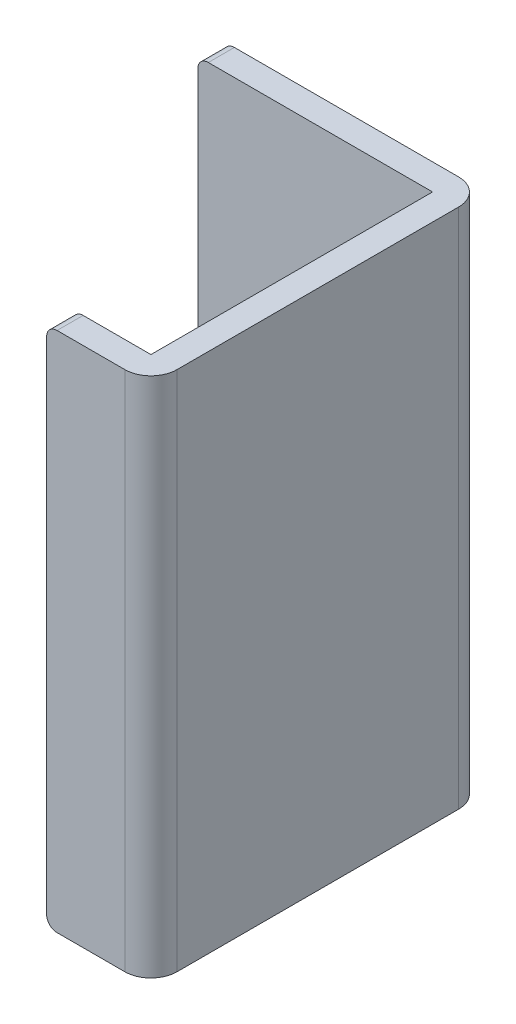
ISO-10303-21;
HEADER;
FILE_DESCRIPTION(('STEP AP214'),'2;1');
FILE_NAME('part.step','',(''),(''),'','','');
FILE_SCHEMA(('AUTOMOTIVE_DESIGN { 1 0 10303 214 1 1 1 1 }'));
ENDSEC;
DATA;
#1=APPLICATION_CONTEXT('core data for automotive mechanical design processes');
#2=APPLICATION_PROTOCOL_DEFINITION('international standard','automotive_design',2000,#1);
#3=PRODUCT_CONTEXT('',#1,'mechanical');
#4=PRODUCT('Part','Part','',(#3));
#5=PRODUCT_RELATED_PRODUCT_CATEGORY('part','',(#4));
#6=PRODUCT_DEFINITION_FORMATION('','',#4);
#7=PRODUCT_DEFINITION_CONTEXT('part definition',#1,'design');
#8=PRODUCT_DEFINITION('design','',#6,#7);
#9=PRODUCT_DEFINITION_SHAPE('','',#8);
#10=(LENGTH_UNIT() NAMED_UNIT(*) SI_UNIT(.MILLI.,.METRE.));
#11=(NAMED_UNIT(*) PLANE_ANGLE_UNIT() SI_UNIT($,.RADIAN.));
#12=(NAMED_UNIT(*) SI_UNIT($,.STERADIAN.) SOLID_ANGLE_UNIT());
#13=UNCERTAINTY_MEASURE_WITH_UNIT(LENGTH_MEASURE(1.E-05),#10,'distance_accuracy_value','');
#14=(GEOMETRIC_REPRESENTATION_CONTEXT(3) GLOBAL_UNCERTAINTY_ASSIGNED_CONTEXT((#13)) GLOBAL_UNIT_ASSIGNED_CONTEXT((#10,
#11,#12)) REPRESENTATION_CONTEXT('',''));
#15=CARTESIAN_POINT('',(0.,0.,0.));
#16=DIRECTION('',(0.,0.,1.));
#17=DIRECTION('',(1.,0.,0.));
#18=AXIS2_PLACEMENT_3D('',#15,#16,#17);
#19=CARTESIAN_POINT('',(0.31,0.24,0.16));
#20=DIRECTION('',(0.,0.,-1.));
#21=DIRECTION('',(1.,0.,0.));
#22=AXIS2_PLACEMENT_3D('',#19,#20,#21);
#23=CYLINDRICAL_SURFACE('',#22,0.01);
#24=CARTESIAN_POINT('',(0.31,0.24,0.));
#25=DIRECTION('',(0.,0.,-1.));
#26=DIRECTION('',(1.,0.,0.));
#27=AXIS2_PLACEMENT_3D('',#24,#25,#26);
#28=CIRCLE('',#27,0.01);
#29=CARTESIAN_POINT('',(0.3,0.24,0.));
#30=VERTEX_POINT('',#29);
#31=CARTESIAN_POINT('',(0.31,0.25,0.));
#32=VERTEX_POINT('',#31);
#33=EDGE_CURVE('E42',#30,#32,#28,.T.);
#34=ORIENTED_EDGE('',*,*,#33,.F.);
#35=DIRECTION('',(0.,0.,-1.));
#36=VECTOR('',#35,1.);
#37=CARTESIAN_POINT('',(0.3,0.24,0.0124999999999979));
#38=LINE('',#37,#36);
#39=CARTESIAN_POINT('',(0.3,0.24,0.024999999999999));
#40=VERTEX_POINT('',#39);
#41=EDGE_CURVE('E220',#40,#30,#38,.T.);
#42=ORIENTED_EDGE('',*,*,#41,.F.);
#43=CARTESIAN_POINT('',(0.31,0.24,0.024999999999999));
#44=DIRECTION('',(0.,0.,1.));
#45=DIRECTION('',(-1.,0.,0.));
#46=AXIS2_PLACEMENT_3D('',#43,#44,#45);
#47=CIRCLE('',#46,0.01);
#48=CARTESIAN_POINT('',(0.31,0.25,0.024999999999999));
#49=VERTEX_POINT('',#48);
#50=EDGE_CURVE('E176',#49,#40,#47,.T.);
#51=ORIENTED_EDGE('',*,*,#50,.F.);
#52=DIRECTION('',(0.,0.,1.));
#53=VECTOR('',#52,1.);
#54=CARTESIAN_POINT('',(0.31,0.25,0.16));
#55=LINE('',#54,#53);
#56=EDGE_CURVE('E185',#32,#49,#55,.T.);
#57=ORIENTED_EDGE('',*,*,#56,.F.);
#58=EDGE_LOOP('',(#34,#42,#51,#57));
#59=FACE_BOUND('',#58,.T.);
#60=ADVANCED_FACE('F17',(#59),#23,.T.);
#61=CARTESIAN_POINT('',(0.31,-0.24,0.0124999999999979));
#62=DIRECTION('',(0.,0.,1.));
#63=DIRECTION('',(-1.,0.,0.));
#64=AXIS2_PLACEMENT_3D('',#61,#62,#63);
#65=CYLINDRICAL_SURFACE('',#64,0.01);
#66=CARTESIAN_POINT('',(0.31,-0.24,0.));
#67=DIRECTION('',(0.,0.,-1.));
#68=DIRECTION('',(1.,0.,0.));
#69=AXIS2_PLACEMENT_3D('',#66,#67,#68);
#70=CIRCLE('',#69,0.01);
#71=CARTESIAN_POINT('',(0.31,-0.25,0.));
#72=VERTEX_POINT('',#71);
#73=CARTESIAN_POINT('',(0.3,-0.24,0.));
#74=VERTEX_POINT('',#73);
#75=EDGE_CURVE('E93',#72,#74,#70,.T.);
#76=ORIENTED_EDGE('',*,*,#75,.F.);
#77=DIRECTION('',(0.,0.,-1.));
#78=VECTOR('',#77,1.);
#79=CARTESIAN_POINT('',(0.31,-0.25,0.));
#80=LINE('',#79,#78);
#81=CARTESIAN_POINT('',(0.31,-0.25,0.024999999999999));
#82=VERTEX_POINT('',#81);
#83=EDGE_CURVE('E153',#82,#72,#80,.T.);
#84=ORIENTED_EDGE('',*,*,#83,.F.);
#85=CARTESIAN_POINT('',(0.31,-0.24,0.024999999999999));
#86=DIRECTION('',(0.,0.,1.));
#87=DIRECTION('',(-1.,0.,0.));
#88=AXIS2_PLACEMENT_3D('',#85,#86,#87);
#89=CIRCLE('',#88,0.01);
#90=CARTESIAN_POINT('',(0.3,-0.24,0.024999999999999));
#91=VERTEX_POINT('',#90);
#92=EDGE_CURVE('E105',#91,#82,#89,.T.);
#93=ORIENTED_EDGE('',*,*,#92,.F.);
#94=DIRECTION('',(0.,0.,1.));
#95=VECTOR('',#94,1.);
#96=CARTESIAN_POINT('',(0.3,-0.24,0.024999999999999));
#97=LINE('',#96,#95);
#98=EDGE_CURVE('E11',#74,#91,#97,.T.);
#99=ORIENTED_EDGE('',*,*,#98,.F.);
#100=EDGE_LOOP('',(#76,#84,#93,#99));
#101=FACE_BOUND('',#100,.T.);
#102=ADVANCED_FACE('F348',(#101),#65,.T.);
#103=CARTESIAN_POINT('',(0.46,0.24,0.16));
#104=DIRECTION('',(0.,0.,-1.));
#105=DIRECTION('',(1.,0.,0.));
#106=AXIS2_PLACEMENT_3D('',#103,#104,#105);
#107=CYLINDRICAL_SURFACE('',#106,0.01);
#108=CARTESIAN_POINT('',(0.46,0.24,0.295));
#109=DIRECTION('',(0.,0.,-1.));
#110=DIRECTION('',(1.,0.,0.));
#111=AXIS2_PLACEMENT_3D('',#108,#109,#110);
#112=CIRCLE('',#111,0.01);
#113=CARTESIAN_POINT('',(0.45,0.24,0.295));
#114=VERTEX_POINT('',#113);
#115=CARTESIAN_POINT('',(0.46,0.25,0.295));
#116=VERTEX_POINT('',#115);
#117=EDGE_CURVE('E241',#114,#116,#112,.T.);
#118=ORIENTED_EDGE('',*,*,#117,.F.);
#119=DIRECTION('',(0.,0.,-1.));
#120=VECTOR('',#119,1.);
#121=CARTESIAN_POINT('',(0.45,0.24,0.3075));
#122=LINE('',#121,#120);
#123=CARTESIAN_POINT('',(0.45,0.24,0.32));
#124=VERTEX_POINT('',#123);
#125=EDGE_CURVE('E179',#124,#114,#122,.T.);
#126=ORIENTED_EDGE('',*,*,#125,.F.);
#127=CARTESIAN_POINT('',(0.46,0.24,0.32));
#128=DIRECTION('',(0.,0.,1.));
#129=DIRECTION('',(-1.,0.,0.));
#130=AXIS2_PLACEMENT_3D('',#127,#128,#129);
#131=CIRCLE('',#130,0.01);
#132=CARTESIAN_POINT('',(0.46,0.25,0.32));
#133=VERTEX_POINT('',#132);
#134=EDGE_CURVE('E21',#133,#124,#131,.T.);
#135=ORIENTED_EDGE('',*,*,#134,.F.);
#136=DIRECTION('',(0.,0.,1.));
#137=VECTOR('',#136,1.);
#138=CARTESIAN_POINT('',(0.46,0.25,0.16));
#139=LINE('',#138,#137);
#140=EDGE_CURVE('E218',#116,#133,#139,.T.);
#141=ORIENTED_EDGE('',*,*,#140,.F.);
#142=EDGE_LOOP('',(#118,#126,#135,#141));
#143=FACE_BOUND('',#142,.T.);
#144=ADVANCED_FACE('F322',(#143),#107,.T.);
#145=CARTESIAN_POINT('',(0.46,-0.24,0.3075));
#146=DIRECTION('',(0.,0.,1.));
#147=DIRECTION('',(-1.,0.,0.));
#148=AXIS2_PLACEMENT_3D('',#145,#146,#147);
#149=CYLINDRICAL_SURFACE('',#148,0.01);
#150=CARTESIAN_POINT('',(0.46,-0.24,0.295));
#151=DIRECTION('',(0.,0.,-1.));
#152=DIRECTION('',(1.,0.,0.));
#153=AXIS2_PLACEMENT_3D('',#150,#151,#152);
#154=CIRCLE('',#153,0.01);
#155=CARTESIAN_POINT('',(0.46,-0.25,0.295));
#156=VERTEX_POINT('',#155);
#157=CARTESIAN_POINT('',(0.45,-0.24,0.295));
#158=VERTEX_POINT('',#157);
#159=EDGE_CURVE('E223',#156,#158,#154,.T.);
#160=ORIENTED_EDGE('',*,*,#159,.F.);
#161=DIRECTION('',(0.,0.,-1.));
#162=VECTOR('',#161,1.);
#163=CARTESIAN_POINT('',(0.46,-0.25,0.295));
#164=LINE('',#163,#162);
#165=CARTESIAN_POINT('',(0.46,-0.25,0.32));
#166=VERTEX_POINT('',#165);
#167=EDGE_CURVE('E155',#166,#156,#164,.T.);
#168=ORIENTED_EDGE('',*,*,#167,.F.);
#169=CARTESIAN_POINT('',(0.46,-0.24,0.32));
#170=DIRECTION('',(0.,0.,1.));
#171=DIRECTION('',(-1.,0.,0.));
#172=AXIS2_PLACEMENT_3D('',#169,#170,#171);
#173=CIRCLE('',#172,0.01);
#174=CARTESIAN_POINT('',(0.45,-0.24,0.32));
#175=VERTEX_POINT('',#174);
#176=EDGE_CURVE('E174',#175,#166,#173,.T.);
#177=ORIENTED_EDGE('',*,*,#176,.F.);
#178=DIRECTION('',(0.,0.,1.));
#179=VECTOR('',#178,1.);
#180=CARTESIAN_POINT('',(0.45,-0.24,0.32));
#181=LINE('',#180,#179);
#182=EDGE_CURVE('E183',#158,#175,#181,.T.);
#183=ORIENTED_EDGE('',*,*,#182,.F.);
#184=EDGE_LOOP('',(#160,#168,#177,#183));
#185=FACE_BOUND('',#184,.T.);
#186=ADVANCED_FACE('F328',(#185),#149,.T.);
#187=CARTESIAN_POINT('',(0.3,-0.25,0.0124999999999979));
#188=DIRECTION('',(1.,0.,0.));
#189=DIRECTION('',(0.,1.,0.));
#190=AXIS2_PLACEMENT_3D('',#187,#188,#189);
#191=PLANE('',#190);
#192=DIRECTION('',(0.,1.,0.));
#193=VECTOR('',#192,1.);
#194=CARTESIAN_POINT('',(0.3,-0.25,0.));
#195=LINE('',#194,#193);
#196=EDGE_CURVE('E172',#74,#30,#195,.T.);
#197=ORIENTED_EDGE('',*,*,#196,.F.);
#198=ORIENTED_EDGE('',*,*,#98,.T.);
#199=DIRECTION('',(0.,1.,0.));
#200=VECTOR('',#199,1.);
#201=CARTESIAN_POINT('',(0.3,-0.25,0.024999999999999));
#202=LINE('',#201,#200);
#203=EDGE_CURVE('E28',#91,#40,#202,.T.);
#204=ORIENTED_EDGE('',*,*,#203,.T.);
#205=ORIENTED_EDGE('',*,*,#41,.T.);
#206=EDGE_LOOP('',(#197,#198,#204,#205));
#207=FACE_BOUND('',#206,.T.);
#208=ADVANCED_FACE('F347',(#207),#191,.F.);
#209=CARTESIAN_POINT('',(0.4125,-0.25,0.024999999999999));
#210=DIRECTION('',(0.,0.,-1.));
#211=DIRECTION('',(-1.,0.,0.));
#212=AXIS2_PLACEMENT_3D('',#209,#210,#211);
#213=PLANE('',#212);
#214=ORIENTED_EDGE('',*,*,#203,.F.);
#215=ORIENTED_EDGE('',*,*,#92,.T.);
#216=DIRECTION('',(1.,0.,0.));
#217=VECTOR('',#216,1.);
#218=CARTESIAN_POINT('',(0.4125,-0.25,0.024999999999999));
#219=LINE('',#218,#217);
#220=CARTESIAN_POINT('',(0.525,-0.25,0.024999999999999));
#221=VERTEX_POINT('',#220);
#222=EDGE_CURVE('E228',#82,#221,#219,.T.);
#223=ORIENTED_EDGE('',*,*,#222,.T.);
#224=DIRECTION('',(0.,1.,0.));
#225=VECTOR('',#224,1.);
#226=CARTESIAN_POINT('',(0.525,-0.25,0.024999999999999));
#227=LINE('',#226,#225);
#228=CARTESIAN_POINT('',(0.525,0.25,0.024999999999999));
#229=VERTEX_POINT('',#228);
#230=EDGE_CURVE('E232',#221,#229,#227,.T.);
#231=ORIENTED_EDGE('',*,*,#230,.T.);
#232=DIRECTION('',(1.,0.,0.));
#233=VECTOR('',#232,1.);
#234=CARTESIAN_POINT('',(0.4125,0.25,0.024999999999999));
#235=LINE('',#234,#233);
#236=EDGE_CURVE('E267',#49,#229,#235,.T.);
#237=ORIENTED_EDGE('',*,*,#236,.F.);
#238=ORIENTED_EDGE('',*,*,#50,.T.);
#239=EDGE_LOOP('',(#214,#215,#223,#231,#237,#238));
#240=FACE_BOUND('',#239,.T.);
#241=ADVANCED_FACE('F343',(#240),#213,.F.);
#242=CARTESIAN_POINT('',(0.4875,-0.25,0.295));
#243=DIRECTION('',(0.,0.,1.));
#244=DIRECTION('',(1.,0.,0.));
#245=AXIS2_PLACEMENT_3D('',#242,#243,#244);
#246=PLANE('',#245);
#247=DIRECTION('',(0.,1.,0.));
#248=VECTOR('',#247,1.);
#249=CARTESIAN_POINT('',(0.45,-0.25,0.295));
#250=LINE('',#249,#248);
#251=EDGE_CURVE('E248',#158,#114,#250,.T.);
#252=ORIENTED_EDGE('',*,*,#251,.T.);
#253=ORIENTED_EDGE('',*,*,#117,.T.);
#254=DIRECTION('',(-1.,0.,0.));
#255=VECTOR('',#254,1.);
#256=CARTESIAN_POINT('',(0.4875,0.25,0.295));
#257=LINE('',#256,#255);
#258=CARTESIAN_POINT('',(0.525,0.25,0.295));
#259=VERTEX_POINT('',#258);
#260=EDGE_CURVE('E272',#259,#116,#257,.T.);
#261=ORIENTED_EDGE('',*,*,#260,.F.);
#262=DIRECTION('',(0.,1.,0.));
#263=VECTOR('',#262,1.);
#264=CARTESIAN_POINT('',(0.525,-0.25,0.295));
#265=LINE('',#264,#263);
#266=CARTESIAN_POINT('',(0.525,-0.25,0.295));
#267=VERTEX_POINT('',#266);
#268=EDGE_CURVE('E256',#267,#259,#265,.T.);
#269=ORIENTED_EDGE('',*,*,#268,.F.);
#270=DIRECTION('',(-1.,0.,0.));
#271=VECTOR('',#270,1.);
#272=CARTESIAN_POINT('',(0.4875,-0.25,0.295));
#273=LINE('',#272,#271);
#274=EDGE_CURVE('E226',#267,#156,#273,.T.);
#275=ORIENTED_EDGE('',*,*,#274,.T.);
#276=ORIENTED_EDGE('',*,*,#159,.T.);
#277=EDGE_LOOP('',(#252,#253,#261,#269,#275,#276));
#278=FACE_BOUND('',#277,.T.);
#279=ADVANCED_FACE('F333',(#278),#246,.F.);
#280=CARTESIAN_POINT('',(0.45,-0.25,0.3075));
#281=DIRECTION('',(1.,0.,0.));
#282=DIRECTION('',(0.,1.,0.));
#283=AXIS2_PLACEMENT_3D('',#280,#281,#282);
#284=PLANE('',#283);
#285=DIRECTION('',(0.,1.,0.));
#286=VECTOR('',#285,1.);
#287=CARTESIAN_POINT('',(0.45,-0.25,0.32));
#288=LINE('',#287,#286);
#289=EDGE_CURVE('E182',#175,#124,#288,.T.);
#290=ORIENTED_EDGE('',*,*,#289,.T.);
#291=ORIENTED_EDGE('',*,*,#125,.T.);
#292=ORIENTED_EDGE('',*,*,#251,.F.);
#293=ORIENTED_EDGE('',*,*,#182,.T.);
#294=EDGE_LOOP('',(#290,#291,#292,#293));
#295=FACE_BOUND('',#294,.T.);
#296=ADVANCED_FACE('F19',(#295),#284,.F.);
#297=CARTESIAN_POINT('',(0.425,0.25,0.16));
#298=DIRECTION('',(0.,-1.,0.));
#299=DIRECTION('',(0.,0.,-1.));
#300=AXIS2_PLACEMENT_3D('',#297,#298,#299);
#301=PLANE('',#300);
#302=ORIENTED_EDGE('',*,*,#260,.T.);
#303=ORIENTED_EDGE('',*,*,#140,.T.);
#304=DIRECTION('',(1.,0.,0.));
#305=VECTOR('',#304,1.);
#306=CARTESIAN_POINT('',(0.5,0.25,0.32));
#307=LINE('',#306,#305);
#308=CARTESIAN_POINT('',(0.525,0.25,0.32));
#309=VERTEX_POINT('',#308);
#310=EDGE_CURVE('E214',#133,#309,#307,.T.);
#311=ORIENTED_EDGE('',*,*,#310,.T.);
#312=CARTESIAN_POINT('',(0.525,0.25,0.295));
#313=DIRECTION('',(0.,1.,0.));
#314=DIRECTION('',(0.,0.,-1.));
#315=AXIS2_PLACEMENT_3D('',#312,#313,#314);
#316=CIRCLE('',#315,0.025);
#317=CARTESIAN_POINT('',(0.55,0.25,0.295));
#318=VERTEX_POINT('',#317);
#319=EDGE_CURVE('E219',#309,#318,#316,.T.);
#320=ORIENTED_EDGE('',*,*,#319,.T.);
#321=DIRECTION('',(0.,0.,-1.));
#322=VECTOR('',#321,1.);
#323=CARTESIAN_POINT('',(0.55,0.25,0.16));
#324=LINE('',#323,#322);
#325=CARTESIAN_POINT('',(0.55,0.25,0.025));
#326=VERTEX_POINT('',#325);
#327=EDGE_CURVE('E266',#318,#326,#324,.T.);
#328=ORIENTED_EDGE('',*,*,#327,.T.);
#329=CARTESIAN_POINT('',(0.525,0.25,0.025));
#330=DIRECTION('',(0.,1.,0.));
#331=DIRECTION('',(0.,0.,-1.));
#332=AXIS2_PLACEMENT_3D('',#329,#330,#331);
#333=CIRCLE('',#332,0.025);
#334=CARTESIAN_POINT('',(0.525,0.25,0.));
#335=VERTEX_POINT('',#334);
#336=EDGE_CURVE('E135',#326,#335,#333,.T.);
#337=ORIENTED_EDGE('',*,*,#336,.T.);
#338=DIRECTION('',(-1.,0.,0.));
#339=VECTOR('',#338,1.);
#340=CARTESIAN_POINT('',(0.425,0.25,0.));
#341=LINE('',#340,#339);
#342=EDGE_CURVE('E142',#335,#32,#341,.T.);
#343=ORIENTED_EDGE('',*,*,#342,.T.);
#344=ORIENTED_EDGE('',*,*,#56,.T.);
#345=ORIENTED_EDGE('',*,*,#236,.T.);
#346=DIRECTION('',(0.,0.,1.));
#347=VECTOR('',#346,1.);
#348=CARTESIAN_POINT('',(0.525,0.25,0.16));
#349=LINE('',#348,#347);
#350=EDGE_CURVE('E210',#229,#259,#349,.T.);
#351=ORIENTED_EDGE('',*,*,#350,.T.);
#352=EDGE_LOOP('',(#302,#303,#311,#320,#328,#337,#343,#344,#345,#351));
#353=FACE_BOUND('',#352,.T.);
#354=ADVANCED_FACE('F299',(#353),#301,.F.);
#355=CARTESIAN_POINT('',(0.425,-0.25,0.16));
#356=DIRECTION('',(0.,-1.,0.));
#357=DIRECTION('',(0.,0.,-1.));
#358=AXIS2_PLACEMENT_3D('',#355,#356,#357);
#359=PLANE('',#358);
#360=ORIENTED_EDGE('',*,*,#222,.F.);
#361=ORIENTED_EDGE('',*,*,#83,.T.);
#362=DIRECTION('',(-1.,0.,0.));
#363=VECTOR('',#362,1.);
#364=CARTESIAN_POINT('',(0.425,-0.25,0.));
#365=LINE('',#364,#363);
#366=CARTESIAN_POINT('',(0.525,-0.25,0.));
#367=VERTEX_POINT('',#366);
#368=EDGE_CURVE('E148',#367,#72,#365,.T.);
#369=ORIENTED_EDGE('',*,*,#368,.F.);
#370=CARTESIAN_POINT('',(0.525,-0.25,0.025));
#371=DIRECTION('',(0.,-1.,0.));
#372=DIRECTION('',(0.,0.,-1.));
#373=AXIS2_PLACEMENT_3D('',#370,#371,#372);
#374=CIRCLE('',#373,0.025);
#375=CARTESIAN_POINT('',(0.55,-0.25,0.025));
#376=VERTEX_POINT('',#375);
#377=EDGE_CURVE('E152',#367,#376,#374,.T.);
#378=ORIENTED_EDGE('',*,*,#377,.T.);
#379=DIRECTION('',(0.,0.,-1.));
#380=VECTOR('',#379,1.);
#381=CARTESIAN_POINT('',(0.55,-0.25,0.16));
#382=LINE('',#381,#380);
#383=CARTESIAN_POINT('',(0.55,-0.25,0.295));
#384=VERTEX_POINT('',#383);
#385=EDGE_CURVE('E193',#384,#376,#382,.T.);
#386=ORIENTED_EDGE('',*,*,#385,.F.);
#387=CARTESIAN_POINT('',(0.525,-0.25,0.295));
#388=DIRECTION('',(0.,-1.,0.));
#389=DIRECTION('',(0.,0.,-1.));
#390=AXIS2_PLACEMENT_3D('',#387,#388,#389);
#391=CIRCLE('',#390,0.025);
#392=CARTESIAN_POINT('',(0.525,-0.25,0.32));
#393=VERTEX_POINT('',#392);
#394=EDGE_CURVE('E162',#384,#393,#391,.T.);
#395=ORIENTED_EDGE('',*,*,#394,.T.);
#396=DIRECTION('',(1.,0.,0.));
#397=VECTOR('',#396,1.);
#398=CARTESIAN_POINT('',(0.5,-0.25,0.32));
#399=LINE('',#398,#397);
#400=EDGE_CURVE('E187',#166,#393,#399,.T.);
#401=ORIENTED_EDGE('',*,*,#400,.F.);
#402=ORIENTED_EDGE('',*,*,#167,.T.);
#403=ORIENTED_EDGE('',*,*,#274,.F.);
#404=DIRECTION('',(0.,0.,1.));
#405=VECTOR('',#404,1.);
#406=CARTESIAN_POINT('',(0.525,-0.25,0.16));
#407=LINE('',#406,#405);
#408=EDGE_CURVE('E252',#221,#267,#407,.T.);
#409=ORIENTED_EDGE('',*,*,#408,.F.);
#410=EDGE_LOOP('',(#360,#361,#369,#378,#386,#395,#401,#402,#403,#409));
#411=FACE_BOUND('',#410,.T.);
#412=ADVANCED_FACE('F151',(#411),#359,.T.);
#413=CARTESIAN_POINT('',(0.425,-0.25,0.));
#414=DIRECTION('',(0.,0.,1.));
#415=DIRECTION('',(1.,0.,0.));
#416=AXIS2_PLACEMENT_3D('',#413,#414,#415);
#417=PLANE('',#416);
#418=ORIENTED_EDGE('',*,*,#368,.T.);
#419=ORIENTED_EDGE('',*,*,#75,.T.);
#420=ORIENTED_EDGE('',*,*,#196,.T.);
#421=ORIENTED_EDGE('',*,*,#33,.T.);
#422=ORIENTED_EDGE('',*,*,#342,.F.);
#423=DIRECTION('',(0.,-1.,0.));
#424=VECTOR('',#423,1.);
#425=CARTESIAN_POINT('',(0.525,-0.25,0.));
#426=LINE('',#425,#424);
#427=EDGE_CURVE('E158',#335,#367,#426,.T.);
#428=ORIENTED_EDGE('',*,*,#427,.T.);
#429=EDGE_LOOP('',(#418,#419,#420,#421,#422,#428));
#430=FACE_BOUND('',#429,.T.);
#431=ADVANCED_FACE('F164',(#430),#417,.F.);
#432=CARTESIAN_POINT('',(0.5,-0.25,0.32));
#433=DIRECTION('',(0.,0.,-1.));
#434=DIRECTION('',(-1.,0.,0.));
#435=AXIS2_PLACEMENT_3D('',#432,#433,#434);
#436=PLANE('',#435);
#437=ORIENTED_EDGE('',*,*,#310,.F.);
#438=ORIENTED_EDGE('',*,*,#134,.T.);
#439=ORIENTED_EDGE('',*,*,#289,.F.);
#440=ORIENTED_EDGE('',*,*,#176,.T.);
#441=ORIENTED_EDGE('',*,*,#400,.T.);
#442=DIRECTION('',(0.,1.,0.));
#443=VECTOR('',#442,1.);
#444=CARTESIAN_POINT('',(0.525,-0.25,0.32));
#445=LINE('',#444,#443);
#446=EDGE_CURVE('E190',#393,#309,#445,.T.);
#447=ORIENTED_EDGE('',*,*,#446,.T.);
#448=EDGE_LOOP('',(#437,#438,#439,#440,#441,#447));
#449=FACE_BOUND('',#448,.T.);
#450=ADVANCED_FACE('F319',(#449),#436,.F.);
#451=CARTESIAN_POINT('',(0.55,-0.25,0.16));
#452=DIRECTION('',(-1.,0.,0.));
#453=DIRECTION('',(0.,0.,1.));
#454=AXIS2_PLACEMENT_3D('',#451,#452,#453);
#455=PLANE('',#454);
#456=ORIENTED_EDGE('',*,*,#385,.T.);
#457=DIRECTION('',(0.,1.,0.));
#458=VECTOR('',#457,1.);
#459=CARTESIAN_POINT('',(0.55,-0.25,0.025));
#460=LINE('',#459,#458);
#461=EDGE_CURVE('E160',#376,#326,#460,.T.);
#462=ORIENTED_EDGE('',*,*,#461,.T.);
#463=ORIENTED_EDGE('',*,*,#327,.F.);
#464=DIRECTION('',(0.,-1.,0.));
#465=VECTOR('',#464,1.);
#466=CARTESIAN_POINT('',(0.55,-0.25,0.295));
#467=LINE('',#466,#465);
#468=EDGE_CURVE('E206',#318,#384,#467,.T.);
#469=ORIENTED_EDGE('',*,*,#468,.T.);
#470=EDGE_LOOP('',(#456,#462,#463,#469));
#471=FACE_BOUND('',#470,.T.);
#472=ADVANCED_FACE('F402',(#471),#455,.F.);
#473=CARTESIAN_POINT('',(0.525,-0.25,0.025));
#474=DIRECTION('',(0.,-1.,0.));
#475=DIRECTION('',(0.,0.,1.));
#476=AXIS2_PLACEMENT_3D('',#473,#474,#475);
#477=CYLINDRICAL_SURFACE('',#476,0.025);
#478=ORIENTED_EDGE('',*,*,#377,.F.);
#479=ORIENTED_EDGE('',*,*,#427,.F.);
#480=ORIENTED_EDGE('',*,*,#336,.F.);
#481=ORIENTED_EDGE('',*,*,#461,.F.);
#482=EDGE_LOOP('',(#478,#479,#480,#481));
#483=FACE_BOUND('',#482,.T.);
#484=ADVANCED_FACE('F157',(#483),#477,.T.);
#485=CARTESIAN_POINT('',(0.525,-0.25,0.295));
#486=DIRECTION('',(0.,-1.,0.));
#487=DIRECTION('',(0.,0.,1.));
#488=AXIS2_PLACEMENT_3D('',#485,#486,#487);
#489=CYLINDRICAL_SURFACE('',#488,0.025);
#490=ORIENTED_EDGE('',*,*,#394,.F.);
#491=ORIENTED_EDGE('',*,*,#468,.F.);
#492=ORIENTED_EDGE('',*,*,#319,.F.);
#493=ORIENTED_EDGE('',*,*,#446,.F.);
#494=EDGE_LOOP('',(#490,#491,#492,#493));
#495=FACE_BOUND('',#494,.T.);
#496=ADVANCED_FACE('F303',(#495),#489,.T.);
#497=CARTESIAN_POINT('',(0.525,-0.25,0.16));
#498=DIRECTION('',(1.,0.,0.));
#499=DIRECTION('',(0.,0.,-1.));
#500=AXIS2_PLACEMENT_3D('',#497,#498,#499);
#501=PLANE('',#500);
#502=ORIENTED_EDGE('',*,*,#350,.F.);
#503=ORIENTED_EDGE('',*,*,#230,.F.);
#504=ORIENTED_EDGE('',*,*,#408,.T.);
#505=ORIENTED_EDGE('',*,*,#268,.T.);
#506=EDGE_LOOP('',(#502,#503,#504,#505));
#507=FACE_BOUND('',#506,.T.);
#508=ADVANCED_FACE('F339',(#507),#501,.F.);
#509=CLOSED_SHELL('',(#60,#102,#144,#186,#208,#241,#279,#296,#354,#412,#431,#450,#472,#484,#496,#508));
#510=MANIFOLD_SOLID_BREP('B1',#509);
#511=ADVANCED_BREP_SHAPE_REPRESENTATION('',(#18,#510),#14);
#512=SHAPE_DEFINITION_REPRESENTATION(#9,#511);
ENDSEC;
END-ISO-10303-21;
